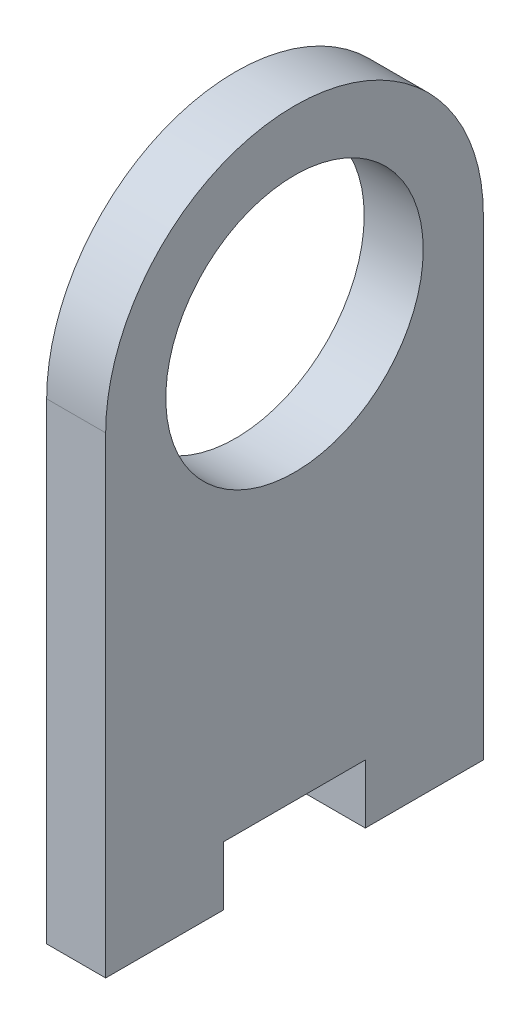
ISO-10303-21;
HEADER;
FILE_DESCRIPTION(('STEP AP214'),'2;1');
FILE_NAME('part.step','',(''),(''),'','','');
FILE_SCHEMA(('AUTOMOTIVE_DESIGN { 1 0 10303 214 1 1 1 1 }'));
ENDSEC;
DATA;
#1=APPLICATION_CONTEXT('core data for automotive mechanical design processes');
#2=APPLICATION_PROTOCOL_DEFINITION('international standard','automotive_design',2000,#1);
#3=PRODUCT_CONTEXT('',#1,'mechanical');
#4=PRODUCT('Part','Part','',(#3));
#5=PRODUCT_RELATED_PRODUCT_CATEGORY('part','',(#4));
#6=PRODUCT_DEFINITION_FORMATION('','',#4);
#7=PRODUCT_DEFINITION_CONTEXT('part definition',#1,'design');
#8=PRODUCT_DEFINITION('design','',#6,#7);
#9=PRODUCT_DEFINITION_SHAPE('','',#8);
#10=(LENGTH_UNIT() NAMED_UNIT(*) SI_UNIT(.MILLI.,.METRE.));
#11=(NAMED_UNIT(*) PLANE_ANGLE_UNIT() SI_UNIT($,.RADIAN.));
#12=(NAMED_UNIT(*) SI_UNIT($,.STERADIAN.) SOLID_ANGLE_UNIT());
#13=UNCERTAINTY_MEASURE_WITH_UNIT(LENGTH_MEASURE(1.E-05),#10,'distance_accuracy_value','');
#14=(GEOMETRIC_REPRESENTATION_CONTEXT(3) GLOBAL_UNCERTAINTY_ASSIGNED_CONTEXT((#13)) GLOBAL_UNIT_ASSIGNED_CONTEXT((#10,
#11,#12)) REPRESENTATION_CONTEXT('',''));
#15=CARTESIAN_POINT('',(0.,0.,0.));
#16=DIRECTION('',(0.,0.,1.));
#17=DIRECTION('',(1.,0.,0.));
#18=AXIS2_PLACEMENT_3D('',#15,#16,#17);
#19=CARTESIAN_POINT('',(6.35,50.8,-20.32));
#20=DIRECTION('',(-1.,0.,0.));
#21=DIRECTION('',(0.,0.,1.));
#22=AXIS2_PLACEMENT_3D('',#19,#20,#21);
#23=PLANE('',#22);
#24=DIRECTION('',(0.,-1.,0.));
#25=VECTOR('',#24,1.);
#26=CARTESIAN_POINT('',(6.35,0.,0.));
#27=LINE('',#26,#25);
#28=CARTESIAN_POINT('',(6.35,50.8,0.));
#29=VERTEX_POINT('',#28);
#30=CARTESIAN_POINT('',(6.35,0.,0.));
#31=VERTEX_POINT('',#30);
#32=EDGE_CURVE('E145',#29,#31,#27,.T.);
#33=ORIENTED_EDGE('',*,*,#32,.T.);
#34=DIRECTION('',(0.,0.,-1.));
#35=VECTOR('',#34,1.);
#36=CARTESIAN_POINT('',(6.35,0.,0.));
#37=LINE('',#36,#35);
#38=CARTESIAN_POINT('',(6.35,0.,-12.7));
#39=VERTEX_POINT('',#38);
#40=EDGE_CURVE('E93',#31,#39,#37,.T.);
#41=ORIENTED_EDGE('',*,*,#40,.T.);
#42=DIRECTION('',(0.,1.,0.));
#43=VECTOR('',#42,1.);
#44=CARTESIAN_POINT('',(6.35,0.,-12.7));
#45=LINE('',#44,#43);
#46=CARTESIAN_POINT('',(6.35,6.35,-12.7));
#47=VERTEX_POINT('',#46);
#48=EDGE_CURVE('E160',#39,#47,#45,.T.);
#49=ORIENTED_EDGE('',*,*,#48,.T.);
#50=DIRECTION('',(0.,0.,-1.));
#51=VECTOR('',#50,1.);
#52=CARTESIAN_POINT('',(6.35,6.35,-12.7));
#53=LINE('',#52,#51);
#54=CARTESIAN_POINT('',(6.35,6.35,-27.94));
#55=VERTEX_POINT('',#54);
#56=EDGE_CURVE('E173',#47,#55,#53,.T.);
#57=ORIENTED_EDGE('',*,*,#56,.T.);
#58=DIRECTION('',(0.,-1.,0.));
#59=VECTOR('',#58,1.);
#60=CARTESIAN_POINT('',(6.35,0.,-27.94));
#61=LINE('',#60,#59);
#62=CARTESIAN_POINT('',(6.35,0.,-27.94));
#63=VERTEX_POINT('',#62);
#64=EDGE_CURVE('E112',#55,#63,#61,.T.);
#65=ORIENTED_EDGE('',*,*,#64,.T.);
#66=DIRECTION('',(0.,0.,-1.));
#67=VECTOR('',#66,1.);
#68=CARTESIAN_POINT('',(6.35,0.,-27.94));
#69=LINE('',#68,#67);
#70=CARTESIAN_POINT('',(6.35,0.,-40.64));
#71=VERTEX_POINT('',#70);
#72=EDGE_CURVE('E106',#63,#71,#69,.T.);
#73=ORIENTED_EDGE('',*,*,#72,.T.);
#74=DIRECTION('',(0.,1.,0.));
#75=VECTOR('',#74,1.);
#76=CARTESIAN_POINT('',(6.35,0.,-40.64));
#77=LINE('',#76,#75);
#78=CARTESIAN_POINT('',(6.35,50.8,-40.64));
#79=VERTEX_POINT('',#78);
#80=EDGE_CURVE('E110',#71,#79,#77,.T.);
#81=ORIENTED_EDGE('',*,*,#80,.T.);
#82=CARTESIAN_POINT('',(6.35,50.8,-20.32));
#83=DIRECTION('',(1.,0.,0.));
#84=DIRECTION('',(0.,0.,1.));
#85=AXIS2_PLACEMENT_3D('',#82,#83,#84);
#86=CIRCLE('',#85,20.32);
#87=EDGE_CURVE('E50',#79,#29,#86,.T.);
#88=ORIENTED_EDGE('',*,*,#87,.T.);
#89=EDGE_LOOP('',(#33,#41,#49,#57,#65,#73,#81,#88));
#90=FACE_BOUND('',#89,.T.);
#91=CARTESIAN_POINT('',(6.35,50.8,-20.32));
#92=DIRECTION('',(1.,0.,0.));
#93=DIRECTION('',(0.,0.,-1.));
#94=AXIS2_PLACEMENT_3D('',#91,#92,#93);
#95=CIRCLE('',#94,13.85);
#96=CARTESIAN_POINT('',(6.35,50.8,-34.17));
#97=VERTEX_POINT('',#96);
#98=EDGE_CURVE('E134',#97,#97,#95,.T.);
#99=ORIENTED_EDGE('',*,*,#98,.F.);
#100=EDGE_LOOP('',(#99));
#101=FACE_BOUND('',#100,.T.);
#102=ADVANCED_FACE('F33',(#90,#101),#23,.F.);
#103=CARTESIAN_POINT('',(0.,50.8,-20.32));
#104=DIRECTION('',(-1.,0.,0.));
#105=DIRECTION('',(0.,0.,1.));
#106=AXIS2_PLACEMENT_3D('',#103,#104,#105);
#107=PLANE('',#106);
#108=DIRECTION('',(0.,-1.,0.));
#109=VECTOR('',#108,1.);
#110=CARTESIAN_POINT('',(0.,0.,0.));
#111=LINE('',#110,#109);
#112=CARTESIAN_POINT('',(0.,50.8,0.));
#113=VERTEX_POINT('',#112);
#114=CARTESIAN_POINT('',(0.,0.,0.));
#115=VERTEX_POINT('',#114);
#116=EDGE_CURVE('E130',#113,#115,#111,.T.);
#117=ORIENTED_EDGE('',*,*,#116,.F.);
#118=CARTESIAN_POINT('',(0.,50.8,-20.32));
#119=DIRECTION('',(1.,0.,0.));
#120=DIRECTION('',(0.,0.,1.));
#121=AXIS2_PLACEMENT_3D('',#118,#119,#120);
#122=CIRCLE('',#121,20.32);
#123=CARTESIAN_POINT('',(0.,50.8,-40.64));
#124=VERTEX_POINT('',#123);
#125=EDGE_CURVE('E85',#124,#113,#122,.T.);
#126=ORIENTED_EDGE('',*,*,#125,.F.);
#127=DIRECTION('',(0.,1.,0.));
#128=VECTOR('',#127,1.);
#129=CARTESIAN_POINT('',(0.,0.,-40.64));
#130=LINE('',#129,#128);
#131=CARTESIAN_POINT('',(0.,0.,-40.64));
#132=VERTEX_POINT('',#131);
#133=EDGE_CURVE('E79',#132,#124,#130,.T.);
#134=ORIENTED_EDGE('',*,*,#133,.F.);
#135=DIRECTION('',(0.,0.,-1.));
#136=VECTOR('',#135,1.);
#137=CARTESIAN_POINT('',(0.,0.,-27.94));
#138=LINE('',#137,#136);
#139=CARTESIAN_POINT('',(0.,0.,-27.94));
#140=VERTEX_POINT('',#139);
#141=EDGE_CURVE('E120',#140,#132,#138,.T.);
#142=ORIENTED_EDGE('',*,*,#141,.F.);
#143=DIRECTION('',(0.,-1.,0.));
#144=VECTOR('',#143,1.);
#145=CARTESIAN_POINT('',(0.,0.,-27.94));
#146=LINE('',#145,#144);
#147=CARTESIAN_POINT('',(0.,6.35,-27.94));
#148=VERTEX_POINT('',#147);
#149=EDGE_CURVE('E140',#148,#140,#146,.T.);
#150=ORIENTED_EDGE('',*,*,#149,.F.);
#151=DIRECTION('',(0.,0.,-1.));
#152=VECTOR('',#151,1.);
#153=CARTESIAN_POINT('',(0.,6.35,-12.7));
#154=LINE('',#153,#152);
#155=CARTESIAN_POINT('',(0.,6.35,-12.7));
#156=VERTEX_POINT('',#155);
#157=EDGE_CURVE('E138',#156,#148,#154,.T.);
#158=ORIENTED_EDGE('',*,*,#157,.F.);
#159=DIRECTION('',(0.,1.,0.));
#160=VECTOR('',#159,1.);
#161=CARTESIAN_POINT('',(0.,0.,-12.7));
#162=LINE('',#161,#160);
#163=CARTESIAN_POINT('',(0.,0.,-12.7));
#164=VERTEX_POINT('',#163);
#165=EDGE_CURVE('E136',#164,#156,#162,.T.);
#166=ORIENTED_EDGE('',*,*,#165,.F.);
#167=DIRECTION('',(0.,0.,-1.));
#168=VECTOR('',#167,1.);
#169=CARTESIAN_POINT('',(0.,0.,0.));
#170=LINE('',#169,#168);
#171=EDGE_CURVE('E133',#115,#164,#170,.T.);
#172=ORIENTED_EDGE('',*,*,#171,.F.);
#173=EDGE_LOOP('',(#117,#126,#134,#142,#150,#158,#166,#172));
#174=FACE_BOUND('',#173,.T.);
#175=CARTESIAN_POINT('',(0.,50.8,-20.32));
#176=DIRECTION('',(1.,0.,0.));
#177=DIRECTION('',(0.,0.,-1.));
#178=AXIS2_PLACEMENT_3D('',#175,#176,#177);
#179=CIRCLE('',#178,13.85);
#180=CARTESIAN_POINT('',(0.,50.8,-34.17));
#181=VERTEX_POINT('',#180);
#182=EDGE_CURVE('E179',#181,#181,#179,.T.);
#183=ORIENTED_EDGE('',*,*,#182,.T.);
#184=EDGE_LOOP('',(#183));
#185=FACE_BOUND('',#184,.T.);
#186=ADVANCED_FACE('F164',(#174,#185),#107,.T.);
#187=CARTESIAN_POINT('',(6.35,0.,0.));
#188=DIRECTION('',(0.,0.,-1.));
#189=DIRECTION('',(-1.,0.,0.));
#190=AXIS2_PLACEMENT_3D('',#187,#188,#189);
#191=PLANE('',#190);
#192=ORIENTED_EDGE('',*,*,#116,.T.);
#193=DIRECTION('',(-1.,0.,0.));
#194=VECTOR('',#193,1.);
#195=CARTESIAN_POINT('',(6.35,0.,0.));
#196=LINE('',#195,#194);
#197=EDGE_CURVE('E11',#31,#115,#196,.T.);
#198=ORIENTED_EDGE('',*,*,#197,.F.);
#199=ORIENTED_EDGE('',*,*,#32,.F.);
#200=DIRECTION('',(-1.,0.,0.));
#201=VECTOR('',#200,1.);
#202=CARTESIAN_POINT('',(6.35,50.8,0.));
#203=LINE('',#202,#201);
#204=EDGE_CURVE('E126',#29,#113,#203,.T.);
#205=ORIENTED_EDGE('',*,*,#204,.T.);
#206=EDGE_LOOP('',(#192,#198,#199,#205));
#207=FACE_BOUND('',#206,.T.);
#208=ADVANCED_FACE('F35',(#207),#191,.F.);
#209=CARTESIAN_POINT('',(6.35,0.,0.));
#210=DIRECTION('',(0.,1.,0.));
#211=DIRECTION('',(0.,0.,1.));
#212=AXIS2_PLACEMENT_3D('',#209,#210,#211);
#213=PLANE('',#212);
#214=ORIENTED_EDGE('',*,*,#171,.T.);
#215=DIRECTION('',(-1.,0.,0.));
#216=VECTOR('',#215,1.);
#217=CARTESIAN_POINT('',(6.35,0.,-12.7));
#218=LINE('',#217,#216);
#219=EDGE_CURVE('E42',#39,#164,#218,.T.);
#220=ORIENTED_EDGE('',*,*,#219,.F.);
#221=ORIENTED_EDGE('',*,*,#40,.F.);
#222=ORIENTED_EDGE('',*,*,#197,.T.);
#223=EDGE_LOOP('',(#214,#220,#221,#222));
#224=FACE_BOUND('',#223,.T.);
#225=ADVANCED_FACE('F207',(#224),#213,.F.);
#226=CARTESIAN_POINT('',(6.35,0.,-12.7));
#227=DIRECTION('',(0.,0.,1.));
#228=DIRECTION('',(1.,0.,0.));
#229=AXIS2_PLACEMENT_3D('',#226,#227,#228);
#230=PLANE('',#229);
#231=ORIENTED_EDGE('',*,*,#165,.T.);
#232=DIRECTION('',(-1.,0.,0.));
#233=VECTOR('',#232,1.);
#234=CARTESIAN_POINT('',(6.35,6.35,-12.7));
#235=LINE('',#234,#233);
#236=EDGE_CURVE('E152',#47,#156,#235,.T.);
#237=ORIENTED_EDGE('',*,*,#236,.F.);
#238=ORIENTED_EDGE('',*,*,#48,.F.);
#239=ORIENTED_EDGE('',*,*,#219,.T.);
#240=EDGE_LOOP('',(#231,#237,#238,#239));
#241=FACE_BOUND('',#240,.T.);
#242=ADVANCED_FACE('F158',(#241),#230,.F.);
#243=CARTESIAN_POINT('',(6.35,6.35,-12.7));
#244=DIRECTION('',(0.,1.,0.));
#245=DIRECTION('',(0.,0.,1.));
#246=AXIS2_PLACEMENT_3D('',#243,#244,#245);
#247=PLANE('',#246);
#248=ORIENTED_EDGE('',*,*,#157,.T.);
#249=DIRECTION('',(-1.,0.,0.));
#250=VECTOR('',#249,1.);
#251=CARTESIAN_POINT('',(6.35,6.35,-27.94));
#252=LINE('',#251,#250);
#253=EDGE_CURVE('E149',#55,#148,#252,.T.);
#254=ORIENTED_EDGE('',*,*,#253,.F.);
#255=ORIENTED_EDGE('',*,*,#56,.F.);
#256=ORIENTED_EDGE('',*,*,#236,.T.);
#257=EDGE_LOOP('',(#248,#254,#255,#256));
#258=FACE_BOUND('',#257,.T.);
#259=ADVANCED_FACE('F169',(#258),#247,.F.);
#260=CARTESIAN_POINT('',(6.35,0.,-27.94));
#261=DIRECTION('',(0.,0.,-1.));
#262=DIRECTION('',(-1.,0.,0.));
#263=AXIS2_PLACEMENT_3D('',#260,#261,#262);
#264=PLANE('',#263);
#265=ORIENTED_EDGE('',*,*,#149,.T.);
#266=DIRECTION('',(-1.,0.,0.));
#267=VECTOR('',#266,1.);
#268=CARTESIAN_POINT('',(6.35,0.,-27.94));
#269=LINE('',#268,#267);
#270=EDGE_CURVE('E121',#63,#140,#269,.T.);
#271=ORIENTED_EDGE('',*,*,#270,.F.);
#272=ORIENTED_EDGE('',*,*,#64,.F.);
#273=ORIENTED_EDGE('',*,*,#253,.T.);
#274=EDGE_LOOP('',(#265,#271,#272,#273));
#275=FACE_BOUND('',#274,.T.);
#276=ADVANCED_FACE('F172',(#275),#264,.F.);
#277=CARTESIAN_POINT('',(6.35,0.,-27.94));
#278=DIRECTION('',(0.,1.,0.));
#279=DIRECTION('',(0.,0.,1.));
#280=AXIS2_PLACEMENT_3D('',#277,#278,#279);
#281=PLANE('',#280);
#282=ORIENTED_EDGE('',*,*,#141,.T.);
#283=DIRECTION('',(-1.,0.,0.));
#284=VECTOR('',#283,1.);
#285=CARTESIAN_POINT('',(6.35,0.,-40.64));
#286=LINE('',#285,#284);
#287=EDGE_CURVE('E117',#71,#132,#286,.T.);
#288=ORIENTED_EDGE('',*,*,#287,.F.);
#289=ORIENTED_EDGE('',*,*,#72,.F.);
#290=ORIENTED_EDGE('',*,*,#270,.T.);
#291=EDGE_LOOP('',(#282,#288,#289,#290));
#292=FACE_BOUND('',#291,.T.);
#293=ADVANCED_FACE('F118',(#292),#281,.F.);
#294=CARTESIAN_POINT('',(6.35,0.,-40.64));
#295=DIRECTION('',(0.,0.,1.));
#296=DIRECTION('',(1.,0.,0.));
#297=AXIS2_PLACEMENT_3D('',#294,#295,#296);
#298=PLANE('',#297);
#299=ORIENTED_EDGE('',*,*,#133,.T.);
#300=DIRECTION('',(-1.,0.,0.));
#301=VECTOR('',#300,1.);
#302=CARTESIAN_POINT('',(6.35,50.8,-40.64));
#303=LINE('',#302,#301);
#304=EDGE_CURVE('E122',#79,#124,#303,.T.);
#305=ORIENTED_EDGE('',*,*,#304,.F.);
#306=ORIENTED_EDGE('',*,*,#80,.F.);
#307=ORIENTED_EDGE('',*,*,#287,.T.);
#308=EDGE_LOOP('',(#299,#305,#306,#307));
#309=FACE_BOUND('',#308,.T.);
#310=ADVANCED_FACE('F124',(#309),#298,.F.);
#311=CARTESIAN_POINT('',(6.35,50.8,-20.32));
#312=DIRECTION('',(-1.,0.,0.));
#313=DIRECTION('',(0.,0.,1.));
#314=AXIS2_PLACEMENT_3D('',#311,#312,#313);
#315=CYLINDRICAL_SURFACE('',#314,20.32);
#316=ORIENTED_EDGE('',*,*,#125,.T.);
#317=ORIENTED_EDGE('',*,*,#204,.F.);
#318=ORIENTED_EDGE('',*,*,#87,.F.);
#319=ORIENTED_EDGE('',*,*,#304,.T.);
#320=EDGE_LOOP('',(#316,#317,#318,#319));
#321=FACE_BOUND('',#320,.T.);
#322=ADVANCED_FACE('F195',(#321),#315,.T.);
#323=CARTESIAN_POINT('',(6.35,50.8,-20.32));
#324=DIRECTION('',(-1.,0.,0.));
#325=DIRECTION('',(0.,0.,1.));
#326=AXIS2_PLACEMENT_3D('',#323,#324,#325);
#327=CYLINDRICAL_SURFACE('',#326,13.85);
#328=ORIENTED_EDGE('',*,*,#98,.T.);
#329=EDGE_LOOP('',(#328));
#330=FACE_BOUND('',#329,.T.);
#331=ORIENTED_EDGE('',*,*,#182,.F.);
#332=EDGE_LOOP('',(#331));
#333=FACE_BOUND('',#332,.T.);
#334=ADVANCED_FACE('F185',(#330,#333),#327,.F.);
#335=CLOSED_SHELL('',(#102,#186,#208,#225,#242,#259,#276,#293,#310,#322,#334));
#336=MANIFOLD_SOLID_BREP('B2',#335);
#337=ADVANCED_BREP_SHAPE_REPRESENTATION('',(#18,#336),#14);
#338=SHAPE_DEFINITION_REPRESENTATION(#9,#337);
ENDSEC;
END-ISO-10303-21;
